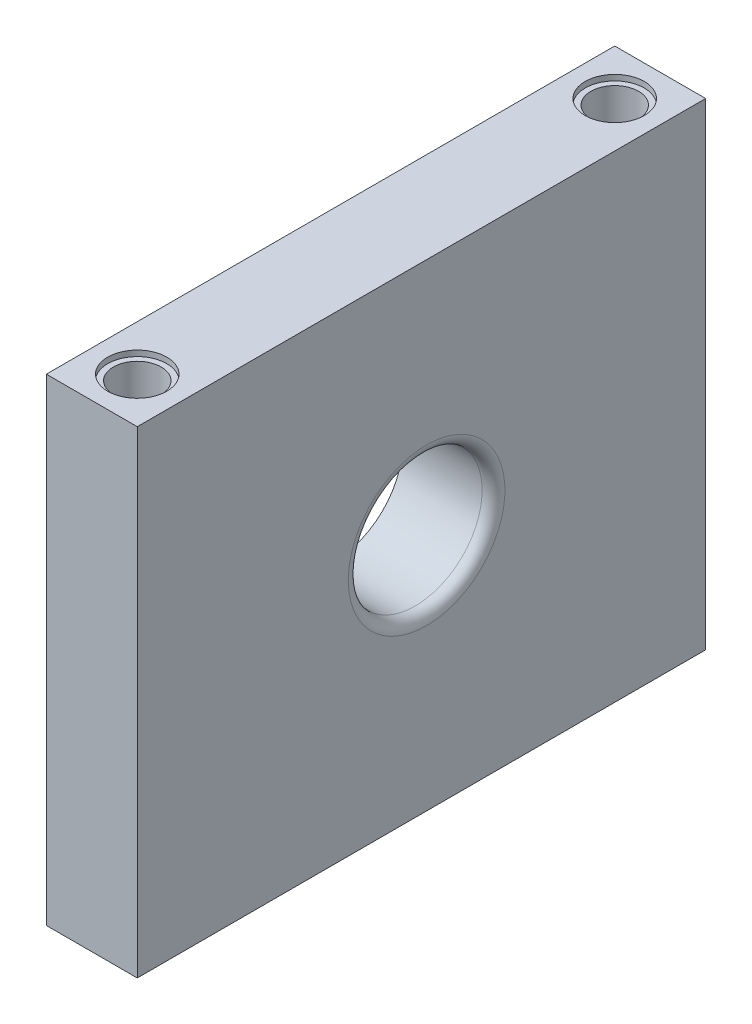
ISO-10303-21;
HEADER;
FILE_DESCRIPTION(('STEP AP214'),'2;1');
FILE_NAME('part.step','',(''),(''),'','','');
FILE_SCHEMA(('AUTOMOTIVE_DESIGN { 1 0 10303 214 1 1 1 1 }'));
ENDSEC;
DATA;
#1=APPLICATION_CONTEXT('core data for automotive mechanical design processes');
#2=APPLICATION_PROTOCOL_DEFINITION('international standard','automotive_design',2000,#1);
#3=PRODUCT_CONTEXT('',#1,'mechanical');
#4=PRODUCT('Part','Part','',(#3));
#5=PRODUCT_RELATED_PRODUCT_CATEGORY('part','',(#4));
#6=PRODUCT_DEFINITION_FORMATION('','',#4);
#7=PRODUCT_DEFINITION_CONTEXT('part definition',#1,'design');
#8=PRODUCT_DEFINITION('design','',#6,#7);
#9=PRODUCT_DEFINITION_SHAPE('','',#8);
#10=(LENGTH_UNIT() NAMED_UNIT(*) SI_UNIT(.MILLI.,.METRE.));
#11=(NAMED_UNIT(*) PLANE_ANGLE_UNIT() SI_UNIT($,.RADIAN.));
#12=(NAMED_UNIT(*) SI_UNIT($,.STERADIAN.) SOLID_ANGLE_UNIT());
#13=UNCERTAINTY_MEASURE_WITH_UNIT(LENGTH_MEASURE(1.E-05),#10,'distance_accuracy_value','');
#14=(GEOMETRIC_REPRESENTATION_CONTEXT(3) GLOBAL_UNCERTAINTY_ASSIGNED_CONTEXT((#13)) GLOBAL_UNIT_ASSIGNED_CONTEXT((#10,
#11,#12)) REPRESENTATION_CONTEXT('',''));
#15=CARTESIAN_POINT('',(0.,0.,0.));
#16=DIRECTION('',(0.,0.,1.));
#17=DIRECTION('',(1.,0.,0.));
#18=AXIS2_PLACEMENT_3D('',#15,#16,#17);
#19=CARTESIAN_POINT('',(-14.2230483271375,-42.,-32.3847583643123));
#20=DIRECTION('',(0.,1.,0.));
#21=DIRECTION('',(0.,0.,1.));
#22=AXIS2_PLACEMENT_3D('',#19,#20,#21);
#23=CYLINDRICAL_SURFACE('',#22,2.1);
#24=CARTESIAN_POINT('',(-14.2230483271375,-41.5,-32.3847583643123));
#25=DIRECTION('',(0.,-1.,0.));
#26=DIRECTION('',(0.,0.,-1.));
#27=AXIS2_PLACEMENT_3D('',#24,#25,#26);
#28=CIRCLE('',#27,2.1);
#29=CARTESIAN_POINT('',(-14.2230483271375,-41.5,-34.4847583643123));
#30=VERTEX_POINT('',#29);
#31=EDGE_CURVE('E100',#30,#30,#28,.T.);
#32=ORIENTED_EDGE('',*,*,#31,.T.);
#33=EDGE_LOOP('',(#32));
#34=FACE_BOUND('',#33,.T.);
#35=CARTESIAN_POINT('',(-14.2230483271375,-0.5,-32.3847583643123));
#36=DIRECTION('',(0.,1.,0.));
#37=DIRECTION('',(0.,0.,1.));
#38=AXIS2_PLACEMENT_3D('',#35,#36,#37);
#39=CIRCLE('',#38,2.1);
#40=CARTESIAN_POINT('',(-14.2230483271375,-0.5,-30.2847583643123));
#41=VERTEX_POINT('',#40);
#42=EDGE_CURVE('E47',#41,#41,#39,.F.);
#43=ORIENTED_EDGE('',*,*,#42,.F.);
#44=EDGE_LOOP('',(#43));
#45=FACE_BOUND('',#44,.T.);
#46=ADVANCED_FACE('F43',(#34,#45),#23,.F.);
#47=CARTESIAN_POINT('',(-14.2230483271375,-42.,9.61524163568774));
#48=DIRECTION('',(0.,1.,0.));
#49=DIRECTION('',(0.,0.,1.));
#50=AXIS2_PLACEMENT_3D('',#47,#48,#49);
#51=CYLINDRICAL_SURFACE('',#50,2.1);
#52=CARTESIAN_POINT('',(-14.2230483271375,-41.5,9.61524163568774));
#53=DIRECTION('',(0.,-1.,0.));
#54=DIRECTION('',(0.,0.,-1.));
#55=AXIS2_PLACEMENT_3D('',#52,#53,#54);
#56=CIRCLE('',#55,2.1);
#57=CARTESIAN_POINT('',(-14.2230483271375,-41.5,7.51524163568774));
#58=VERTEX_POINT('',#57);
#59=EDGE_CURVE('E120',#58,#58,#56,.F.);
#60=ORIENTED_EDGE('',*,*,#59,.F.);
#61=EDGE_LOOP('',(#60));
#62=FACE_BOUND('',#61,.T.);
#63=CARTESIAN_POINT('',(-14.2230483271375,-0.5,9.61524163568774));
#64=DIRECTION('',(0.,1.,0.));
#65=DIRECTION('',(0.,0.,1.));
#66=AXIS2_PLACEMENT_3D('',#63,#64,#65);
#67=CIRCLE('',#66,2.1);
#68=CARTESIAN_POINT('',(-14.2230483271375,-0.5,11.7152416356877));
#69=VERTEX_POINT('',#68);
#70=EDGE_CURVE('E117',#69,#69,#67,.T.);
#71=ORIENTED_EDGE('',*,*,#70,.T.);
#72=EDGE_LOOP('',(#71));
#73=FACE_BOUND('',#72,.T.);
#74=ADVANCED_FACE('F205',(#62,#73),#51,.F.);
#75=CARTESIAN_POINT('',(-10.2230483271375,3.,13.6152416356877));
#76=DIRECTION('',(0.,0.,-1.));
#77=DIRECTION('',(-1.,0.,0.));
#78=AXIS2_PLACEMENT_3D('',#75,#76,#77);
#79=PLANE('',#78);
#80=DIRECTION('',(0.,1.,0.));
#81=VECTOR('',#80,1.);
#82=CARTESIAN_POINT('',(-10.2230483271376,-42.,13.6152416356877));
#83=LINE('',#82,#81);
#84=CARTESIAN_POINT('',(-10.2230483271376,-42.,13.6152416356877));
#85=VERTEX_POINT('',#84);
#86=CARTESIAN_POINT('',(-10.2230483271376,0.,13.6152416356877));
#87=VERTEX_POINT('',#86);
#88=EDGE_CURVE('E98',#85,#87,#83,.T.);
#89=ORIENTED_EDGE('',*,*,#88,.T.);
#90=DIRECTION('',(1.,0.,0.));
#91=VECTOR('',#90,1.);
#92=CARTESIAN_POINT('',(14.7769516728625,0.,13.6152416356877));
#93=LINE('',#92,#91);
#94=CARTESIAN_POINT('',(-18.2230483271375,0.,13.6152416356877));
#95=VERTEX_POINT('',#94);
#96=EDGE_CURVE('E86',#95,#87,#93,.T.);
#97=ORIENTED_EDGE('',*,*,#96,.F.);
#98=DIRECTION('',(0.,1.,0.));
#99=VECTOR('',#98,1.);
#100=CARTESIAN_POINT('',(-18.2230483271375,3.,13.6152416356877));
#101=LINE('',#100,#99);
#102=CARTESIAN_POINT('',(-18.2230483271376,-42.,13.6152416356877));
#103=VERTEX_POINT('',#102);
#104=EDGE_CURVE('E62',#103,#95,#101,.T.);
#105=ORIENTED_EDGE('',*,*,#104,.F.);
#106=DIRECTION('',(-1.,0.,0.));
#107=VECTOR('',#106,1.);
#108=CARTESIAN_POINT('',(-18.2230483271376,-42.,13.6152416356877));
#109=LINE('',#108,#107);
#110=EDGE_CURVE('E173',#85,#103,#109,.T.);
#111=ORIENTED_EDGE('',*,*,#110,.F.);
#112=EDGE_LOOP('',(#89,#97,#105,#111));
#113=FACE_BOUND('',#112,.T.);
#114=ADVANCED_FACE('F96',(#113),#79,.F.);
#115=CARTESIAN_POINT('',(-10.2230483271376,3.,-36.3847583643123));
#116=DIRECTION('',(0.,0.,1.));
#117=DIRECTION('',(1.,0.,0.));
#118=AXIS2_PLACEMENT_3D('',#115,#116,#117);
#119=PLANE('',#118);
#120=DIRECTION('',(0.,-1.,0.));
#121=VECTOR('',#120,1.);
#122=CARTESIAN_POINT('',(-18.2230483271376,3.,-36.3847583643123));
#123=LINE('',#122,#121);
#124=CARTESIAN_POINT('',(-18.2230483271376,0.,-36.3847583643123));
#125=VERTEX_POINT('',#124);
#126=CARTESIAN_POINT('',(-18.2230483271376,-42.,-36.3847583643123));
#127=VERTEX_POINT('',#126);
#128=EDGE_CURVE('E108',#125,#127,#123,.T.);
#129=ORIENTED_EDGE('',*,*,#128,.F.);
#130=DIRECTION('',(1.,0.,0.));
#131=VECTOR('',#130,1.);
#132=CARTESIAN_POINT('',(14.7769516728625,0.,-36.3847583643123));
#133=LINE('',#132,#131);
#134=CARTESIAN_POINT('',(-10.2230483271376,0.,-36.3847583643123));
#135=VERTEX_POINT('',#134);
#136=EDGE_CURVE('E89',#125,#135,#133,.T.);
#137=ORIENTED_EDGE('',*,*,#136,.T.);
#138=DIRECTION('',(0.,1.,0.));
#139=VECTOR('',#138,1.);
#140=CARTESIAN_POINT('',(-10.2230483271376,-42.,-36.3847583643123));
#141=LINE('',#140,#139);
#142=CARTESIAN_POINT('',(-10.2230483271376,-42.,-36.3847583643123));
#143=VERTEX_POINT('',#142);
#144=EDGE_CURVE('E114',#143,#135,#141,.T.);
#145=ORIENTED_EDGE('',*,*,#144,.F.);
#146=DIRECTION('',(1.,0.,0.));
#147=VECTOR('',#146,1.);
#148=CARTESIAN_POINT('',(-18.2230483271376,-42.,-36.3847583643123));
#149=LINE('',#148,#147);
#150=EDGE_CURVE('E167',#127,#143,#149,.T.);
#151=ORIENTED_EDGE('',*,*,#150,.F.);
#152=EDGE_LOOP('',(#129,#137,#145,#151));
#153=FACE_BOUND('',#152,.T.);
#154=ADVANCED_FACE('F187',(#153),#119,.F.);
#155=CARTESIAN_POINT('',(-18.2230483271375,0.,0.));
#156=DIRECTION('',(-1.,0.,0.));
#157=DIRECTION('',(0.,0.,1.));
#158=AXIS2_PLACEMENT_3D('',#155,#156,#157);
#159=PLANE('',#158);
#160=DIRECTION('',(0.,0.,1.));
#161=VECTOR('',#160,1.);
#162=CARTESIAN_POINT('',(-18.2230483271375,0.,0.));
#163=LINE('',#162,#161);
#164=EDGE_CURVE('E84',#125,#95,#163,.T.);
#165=ORIENTED_EDGE('',*,*,#164,.F.);
#166=ORIENTED_EDGE('',*,*,#128,.T.);
#167=DIRECTION('',(0.,0.,-1.));
#168=VECTOR('',#167,1.);
#169=CARTESIAN_POINT('',(-18.2230483271376,-42.,-36.3847583643123));
#170=LINE('',#169,#168);
#171=EDGE_CURVE('E106',#103,#127,#170,.T.);
#172=ORIENTED_EDGE('',*,*,#171,.F.);
#173=ORIENTED_EDGE('',*,*,#104,.T.);
#174=EDGE_LOOP('',(#165,#166,#172,#173));
#175=FACE_BOUND('',#174,.T.);
#176=CARTESIAN_POINT('',(-18.2230483271375,-21.,-11.836279123996));
#177=DIRECTION('',(-1.,0.,0.));
#178=DIRECTION('',(0.,0.,1.));
#179=AXIS2_PLACEMENT_3D('',#176,#177,#178);
#180=CIRCLE('',#179,5.88897274573419);
#181=CARTESIAN_POINT('',(-18.2230483271375,-21.,-5.94730637826181));
#182=VERTEX_POINT('',#181);
#183=EDGE_CURVE('E93',#182,#182,#180,.T.);
#184=ORIENTED_EDGE('',*,*,#183,.F.);
#185=EDGE_LOOP('',(#184));
#186=FACE_BOUND('',#185,.T.);
#187=ADVANCED_FACE('F103',(#175,#186),#159,.T.);
#188=CARTESIAN_POINT('',(-10.2230483271376,-42.,-36.3847583643123));
#189=DIRECTION('',(-1.,0.,0.));
#190=DIRECTION('',(0.,0.,1.));
#191=AXIS2_PLACEMENT_3D('',#188,#189,#190);
#192=PLANE('',#191);
#193=CARTESIAN_POINT('',(-10.2230483271376,-21.,-11.836279123996));
#194=DIRECTION('',(-1.,0.,0.));
#195=DIRECTION('',(0.,0.,1.));
#196=AXIS2_PLACEMENT_3D('',#193,#194,#195);
#197=CIRCLE('',#196,6.88897274573419);
#198=CARTESIAN_POINT('',(-10.2230483271376,-21.,-4.94730637826182));
#199=VERTEX_POINT('',#198);
#200=EDGE_CURVE('E54',#199,#199,#197,.T.);
#201=ORIENTED_EDGE('',*,*,#200,.T.);
#202=EDGE_LOOP('',(#201));
#203=FACE_BOUND('',#202,.T.);
#204=DIRECTION('',(0.,0.,1.));
#205=VECTOR('',#204,1.);
#206=CARTESIAN_POINT('',(-10.2230483271376,0.,-36.3847583643123));
#207=LINE('',#206,#205);
#208=EDGE_CURVE('E153',#135,#87,#207,.T.);
#209=ORIENTED_EDGE('',*,*,#208,.T.);
#210=ORIENTED_EDGE('',*,*,#88,.F.);
#211=DIRECTION('',(0.,0.,1.));
#212=VECTOR('',#211,1.);
#213=CARTESIAN_POINT('',(-10.2230483271376,-42.,-36.3847583643123));
#214=LINE('',#213,#212);
#215=EDGE_CURVE('E170',#143,#85,#214,.T.);
#216=ORIENTED_EDGE('',*,*,#215,.F.);
#217=ORIENTED_EDGE('',*,*,#144,.T.);
#218=EDGE_LOOP('',(#209,#210,#216,#217));
#219=FACE_BOUND('',#218,.T.);
#220=ADVANCED_FACE('F184',(#203,#219),#192,.F.);
#221=CARTESIAN_POINT('',(0.,-42.,0.));
#222=DIRECTION('',(0.,1.,0.));
#223=DIRECTION('',(0.,0.,1.));
#224=AXIS2_PLACEMENT_3D('',#221,#222,#223);
#225=PLANE('',#224);
#226=CARTESIAN_POINT('',(-14.2230483271375,-42.,-32.3847583643123));
#227=DIRECTION('',(0.,1.,0.));
#228=DIRECTION('',(0.,0.,1.));
#229=AXIS2_PLACEMENT_3D('',#226,#227,#228);
#230=CIRCLE('',#229,2.65);
#231=CARTESIAN_POINT('',(-14.2230483271375,-42.,-29.7347583643123));
#232=VERTEX_POINT('',#231);
#233=EDGE_CURVE('E154',#232,#232,#230,.T.);
#234=ORIENTED_EDGE('',*,*,#233,.T.);
#235=EDGE_LOOP('',(#234));
#236=FACE_BOUND('',#235,.T.);
#237=CARTESIAN_POINT('',(-14.2230483271375,-42.,9.61524163568773));
#238=DIRECTION('',(0.,1.,0.));
#239=DIRECTION('',(0.,0.,1.));
#240=AXIS2_PLACEMENT_3D('',#237,#238,#239);
#241=CIRCLE('',#240,2.65);
#242=CARTESIAN_POINT('',(-14.2230483271375,-42.,12.2652416356877));
#243=VERTEX_POINT('',#242);
#244=EDGE_CURVE('E148',#243,#243,#241,.T.);
#245=ORIENTED_EDGE('',*,*,#244,.T.);
#246=EDGE_LOOP('',(#245));
#247=FACE_BOUND('',#246,.T.);
#248=ORIENTED_EDGE('',*,*,#171,.T.);
#249=ORIENTED_EDGE('',*,*,#150,.T.);
#250=ORIENTED_EDGE('',*,*,#215,.T.);
#251=ORIENTED_EDGE('',*,*,#110,.T.);
#252=EDGE_LOOP('',(#248,#249,#250,#251));
#253=FACE_BOUND('',#252,.T.);
#254=ADVANCED_FACE('F189',(#236,#247,#253),#225,.F.);
#255=CARTESIAN_POINT('',(-14.2230483271375,-41.5,9.61524163568773));
#256=DIRECTION('',(0.,-1.,0.));
#257=DIRECTION('',(0.,0.,-1.));
#258=AXIS2_PLACEMENT_3D('',#255,#256,#257);
#259=CYLINDRICAL_SURFACE('',#258,2.65);
#260=CARTESIAN_POINT('',(-14.2230483271375,-41.5,9.61524163568773));
#261=DIRECTION('',(0.,1.,0.));
#262=DIRECTION('',(0.,0.,1.));
#263=AXIS2_PLACEMENT_3D('',#260,#261,#262);
#264=CIRCLE('',#263,2.65);
#265=CARTESIAN_POINT('',(-14.2230483271375,-41.5,12.2652416356877));
#266=VERTEX_POINT('',#265);
#267=EDGE_CURVE('E158',#266,#266,#264,.T.);
#268=ORIENTED_EDGE('',*,*,#267,.T.);
#269=EDGE_LOOP('',(#268));
#270=FACE_BOUND('',#269,.T.);
#271=ORIENTED_EDGE('',*,*,#244,.F.);
#272=EDGE_LOOP('',(#271));
#273=FACE_BOUND('',#272,.T.);
#274=ADVANCED_FACE('F191',(#270,#273),#259,.F.);
#275=CARTESIAN_POINT('',(-14.2230483271375,-41.5,9.61524163568773));
#276=DIRECTION('',(0.,-1.,0.));
#277=DIRECTION('',(0.,0.,1.));
#278=AXIS2_PLACEMENT_3D('',#275,#276,#277);
#279=PLANE('',#278);
#280=ORIENTED_EDGE('',*,*,#59,.T.);
#281=EDGE_LOOP('',(#280));
#282=FACE_BOUND('',#281,.T.);
#283=ORIENTED_EDGE('',*,*,#267,.F.);
#284=EDGE_LOOP('',(#283));
#285=FACE_BOUND('',#284,.T.);
#286=ADVANCED_FACE('F198',(#282,#285),#279,.T.);
#287=CARTESIAN_POINT('',(-14.2230483271375,-41.5,-32.3847583643123));
#288=DIRECTION('',(0.,-1.,0.));
#289=DIRECTION('',(0.,0.,-1.));
#290=AXIS2_PLACEMENT_3D('',#287,#288,#289);
#291=CYLINDRICAL_SURFACE('',#290,2.65);
#292=CARTESIAN_POINT('',(-14.2230483271375,-41.5,-32.3847583643123));
#293=DIRECTION('',(0.,1.,0.));
#294=DIRECTION('',(0.,0.,1.));
#295=AXIS2_PLACEMENT_3D('',#292,#293,#294);
#296=CIRCLE('',#295,2.65);
#297=CARTESIAN_POINT('',(-14.2230483271375,-41.5,-29.7347583643123));
#298=VERTEX_POINT('',#297);
#299=EDGE_CURVE('E149',#298,#298,#296,.T.);
#300=ORIENTED_EDGE('',*,*,#299,.T.);
#301=EDGE_LOOP('',(#300));
#302=FACE_BOUND('',#301,.T.);
#303=ORIENTED_EDGE('',*,*,#233,.F.);
#304=EDGE_LOOP('',(#303));
#305=FACE_BOUND('',#304,.T.);
#306=ADVANCED_FACE('F227',(#302,#305),#291,.F.);
#307=CARTESIAN_POINT('',(-14.2230483271375,-41.5,-32.3847583643123));
#308=DIRECTION('',(0.,-1.,0.));
#309=DIRECTION('',(0.,0.,1.));
#310=AXIS2_PLACEMENT_3D('',#307,#308,#309);
#311=PLANE('',#310);
#312=ORIENTED_EDGE('',*,*,#31,.F.);
#313=EDGE_LOOP('',(#312));
#314=FACE_BOUND('',#313,.T.);
#315=ORIENTED_EDGE('',*,*,#299,.F.);
#316=EDGE_LOOP('',(#315));
#317=FACE_BOUND('',#316,.T.);
#318=ADVANCED_FACE('F223',(#314,#317),#311,.T.);
#319=CARTESIAN_POINT('',(-9.22304832713755,-21.,-11.836279123996));
#320=DIRECTION('',(-1.,0.,0.));
#321=DIRECTION('',(0.,0.,1.));
#322=AXIS2_PLACEMENT_3D('',#319,#320,#321);
#323=CYLINDRICAL_SURFACE('',#322,5.88897274573419);
#324=CARTESIAN_POINT('',(-11.2230483271376,-21.,-11.836279123996));
#325=DIRECTION('',(-1.,0.,0.));
#326=DIRECTION('',(0.,0.,1.));
#327=AXIS2_PLACEMENT_3D('',#324,#325,#326);
#328=CIRCLE('',#327,5.88897274573419);
#329=CARTESIAN_POINT('',(-11.2230483271376,-21.,-5.94730637826182));
#330=VERTEX_POINT('',#329);
#331=EDGE_CURVE('E11',#330,#330,#328,.F.);
#332=ORIENTED_EDGE('',*,*,#331,.T.);
#333=EDGE_LOOP('',(#332));
#334=FACE_BOUND('',#333,.T.);
#335=ORIENTED_EDGE('',*,*,#183,.T.);
#336=EDGE_LOOP('',(#335));
#337=FACE_BOUND('',#336,.T.);
#338=ADVANCED_FACE('F220',(#334,#337),#323,.F.);
#339=CARTESIAN_POINT('',(-11.2230483271376,-21.,-11.836279123996));
#340=DIRECTION('',(-1.,0.,0.));
#341=DIRECTION('',(0.,0.,1.));
#342=AXIS2_PLACEMENT_3D('',#339,#340,#341);
#343=TOROIDAL_SURFACE('',#342,6.88897274573419,1.);
#344=ORIENTED_EDGE('',*,*,#331,.F.);
#345=EDGE_LOOP('',(#344));
#346=FACE_BOUND('',#345,.T.);
#347=ORIENTED_EDGE('',*,*,#200,.F.);
#348=EDGE_LOOP('',(#347));
#349=FACE_BOUND('',#348,.T.);
#350=ADVANCED_FACE('F45',(#346,#349),#343,.T.);
#351=CARTESIAN_POINT('',(14.7769516728625,0.,-36.3847583643123));
#352=DIRECTION('',(0.,-1.,0.));
#353=DIRECTION('',(0.,0.,-1.));
#354=AXIS2_PLACEMENT_3D('',#351,#352,#353);
#355=PLANE('',#354);
#356=CARTESIAN_POINT('',(-14.2230483271375,0.,-32.3847583643123));
#357=DIRECTION('',(0.,-1.,0.));
#358=DIRECTION('',(0.,0.,-1.));
#359=AXIS2_PLACEMENT_3D('',#356,#357,#358);
#360=CIRCLE('',#359,2.6);
#361=CARTESIAN_POINT('',(-14.2230483271375,0.,-34.9847583643123));
#362=VERTEX_POINT('',#361);
#363=EDGE_CURVE('E137',#362,#362,#360,.T.);
#364=ORIENTED_EDGE('',*,*,#363,.T.);
#365=EDGE_LOOP('',(#364));
#366=FACE_BOUND('',#365,.T.);
#367=CARTESIAN_POINT('',(-14.2230483271375,0.,9.61524163568774));
#368=DIRECTION('',(0.,1.,0.));
#369=DIRECTION('',(0.,0.,1.));
#370=AXIS2_PLACEMENT_3D('',#367,#368,#369);
#371=CIRCLE('',#370,2.6);
#372=CARTESIAN_POINT('',(-14.2230483271375,0.,12.2152416356877));
#373=VERTEX_POINT('',#372);
#374=EDGE_CURVE('E129',#373,#373,#371,.T.);
#375=ORIENTED_EDGE('',*,*,#374,.F.);
#376=EDGE_LOOP('',(#375));
#377=FACE_BOUND('',#376,.T.);
#378=ORIENTED_EDGE('',*,*,#164,.T.);
#379=ORIENTED_EDGE('',*,*,#96,.T.);
#380=ORIENTED_EDGE('',*,*,#208,.F.);
#381=ORIENTED_EDGE('',*,*,#136,.F.);
#382=EDGE_LOOP('',(#378,#379,#380,#381));
#383=FACE_BOUND('',#382,.T.);
#384=ADVANCED_FACE('F85',(#366,#377,#383),#355,.F.);
#385=CARTESIAN_POINT('',(-14.2230483271375,-0.5,9.61524163568774));
#386=DIRECTION('',(0.,1.,0.));
#387=DIRECTION('',(0.,0.,1.));
#388=AXIS2_PLACEMENT_3D('',#385,#386,#387);
#389=CYLINDRICAL_SURFACE('',#388,2.6);
#390=CARTESIAN_POINT('',(-14.2230483271375,-0.5,9.61524163568774));
#391=DIRECTION('',(0.,1.,0.));
#392=DIRECTION('',(0.,0.,1.));
#393=AXIS2_PLACEMENT_3D('',#390,#391,#392);
#394=CIRCLE('',#393,2.6);
#395=CARTESIAN_POINT('',(-14.2230483271375,-0.5,12.2152416356877));
#396=VERTEX_POINT('',#395);
#397=EDGE_CURVE('E121',#396,#396,#394,.T.);
#398=ORIENTED_EDGE('',*,*,#397,.F.);
#399=EDGE_LOOP('',(#398));
#400=FACE_BOUND('',#399,.T.);
#401=ORIENTED_EDGE('',*,*,#374,.T.);
#402=EDGE_LOOP('',(#401));
#403=FACE_BOUND('',#402,.T.);
#404=ADVANCED_FACE('F218',(#400,#403),#389,.F.);
#405=CARTESIAN_POINT('',(-14.2230483271375,-0.5,9.61524163568774));
#406=DIRECTION('',(0.,1.,0.));
#407=DIRECTION('',(0.,0.,1.));
#408=AXIS2_PLACEMENT_3D('',#405,#406,#407);
#409=PLANE('',#408);
#410=ORIENTED_EDGE('',*,*,#70,.F.);
#411=EDGE_LOOP('',(#410));
#412=FACE_BOUND('',#411,.T.);
#413=ORIENTED_EDGE('',*,*,#397,.T.);
#414=EDGE_LOOP('',(#413));
#415=FACE_BOUND('',#414,.T.);
#416=ADVANCED_FACE('F275',(#412,#415),#409,.T.);
#417=CARTESIAN_POINT('',(-14.2230483271375,-0.5,-32.3847583643123));
#418=DIRECTION('',(0.,1.,0.));
#419=DIRECTION('',(0.,0.,-1.));
#420=AXIS2_PLACEMENT_3D('',#417,#418,#419);
#421=PLANE('',#420);
#422=CARTESIAN_POINT('',(-14.2230483271375,-0.5,-32.3847583643123));
#423=DIRECTION('',(0.,-1.,0.));
#424=DIRECTION('',(0.,0.,-1.));
#425=AXIS2_PLACEMENT_3D('',#422,#423,#424);
#426=CIRCLE('',#425,2.6);
#427=CARTESIAN_POINT('',(-14.2230483271375,-0.5,-34.9847583643123));
#428=VERTEX_POINT('',#427);
#429=EDGE_CURVE('E382',#428,#428,#426,.T.);
#430=ORIENTED_EDGE('',*,*,#429,.F.);
#431=EDGE_LOOP('',(#430));
#432=FACE_BOUND('',#431,.T.);
#433=ORIENTED_EDGE('',*,*,#42,.T.);
#434=EDGE_LOOP('',(#433));
#435=FACE_BOUND('',#434,.T.);
#436=ADVANCED_FACE('F282',(#432,#435),#421,.T.);
#437=CARTESIAN_POINT('',(-14.2230483271375,-0.5,-32.3847583643123));
#438=DIRECTION('',(0.,1.,0.));
#439=DIRECTION('',(0.,0.,1.));
#440=AXIS2_PLACEMENT_3D('',#437,#438,#439);
#441=CYLINDRICAL_SURFACE('',#440,2.6);
#442=ORIENTED_EDGE('',*,*,#429,.T.);
#443=EDGE_LOOP('',(#442));
#444=FACE_BOUND('',#443,.T.);
#445=ORIENTED_EDGE('',*,*,#363,.F.);
#446=EDGE_LOOP('',(#445));
#447=FACE_BOUND('',#446,.T.);
#448=ADVANCED_FACE('F289',(#444,#447),#441,.F.);
#449=CLOSED_SHELL('',(#46,#74,#114,#154,#187,#220,#254,#274,#286,#306,#318,#338,#350,#384,#404,
#416,#436,#448));
#450=MANIFOLD_SOLID_BREP('B2',#449);
#451=ADVANCED_BREP_SHAPE_REPRESENTATION('',(#18,#450),#14);
#452=SHAPE_DEFINITION_REPRESENTATION(#9,#451);
ENDSEC;
END-ISO-10303-21;
